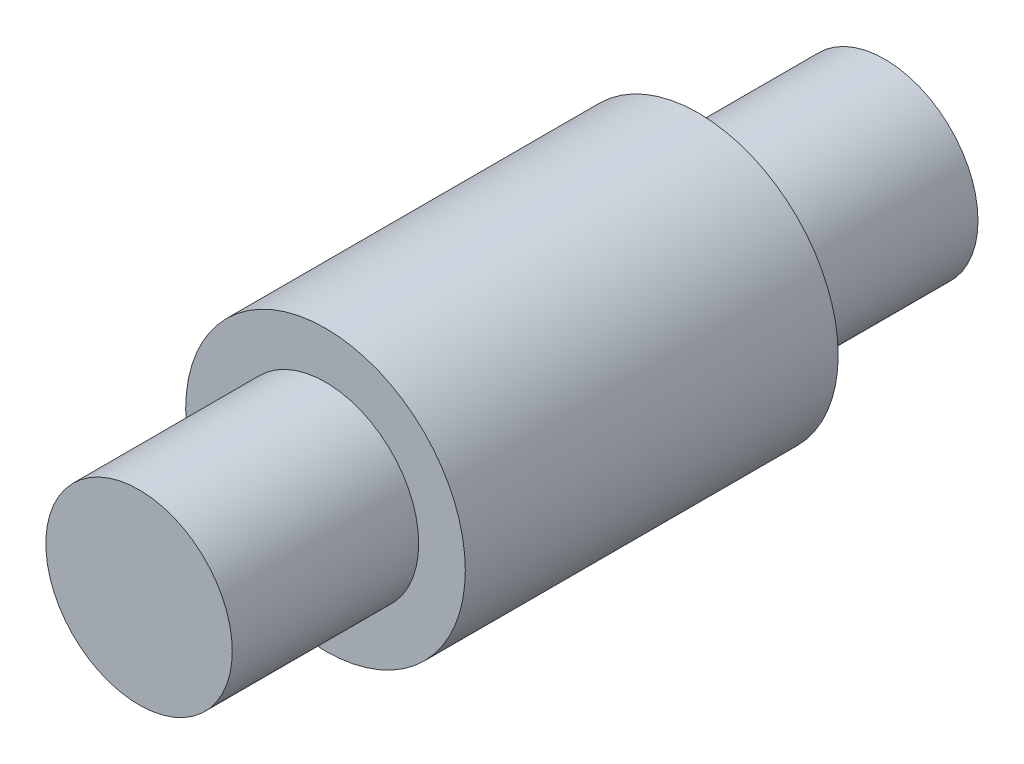
ISO-10303-21;
HEADER;
FILE_DESCRIPTION(('STEP AP214'),'2;1');
FILE_NAME('part.step','',(''),(''),'','','');
FILE_SCHEMA(('AUTOMOTIVE_DESIGN { 1 0 10303 214 1 1 1 1 }'));
ENDSEC;
DATA;
#1=APPLICATION_CONTEXT('core data for automotive mechanical design processes');
#2=APPLICATION_PROTOCOL_DEFINITION('international standard','automotive_design',2000,#1);
#3=PRODUCT_CONTEXT('',#1,'mechanical');
#4=PRODUCT('Part','Part','',(#3));
#5=PRODUCT_RELATED_PRODUCT_CATEGORY('part','',(#4));
#6=PRODUCT_DEFINITION_FORMATION('','',#4);
#7=PRODUCT_DEFINITION_CONTEXT('part definition',#1,'design');
#8=PRODUCT_DEFINITION('design','',#6,#7);
#9=PRODUCT_DEFINITION_SHAPE('','',#8);
#10=(LENGTH_UNIT() NAMED_UNIT(*) SI_UNIT(.MILLI.,.METRE.));
#11=(NAMED_UNIT(*) PLANE_ANGLE_UNIT() SI_UNIT($,.RADIAN.));
#12=(NAMED_UNIT(*) SI_UNIT($,.STERADIAN.) SOLID_ANGLE_UNIT());
#13=UNCERTAINTY_MEASURE_WITH_UNIT(LENGTH_MEASURE(1.E-05),#10,'distance_accuracy_value','');
#14=(GEOMETRIC_REPRESENTATION_CONTEXT(3) GLOBAL_UNCERTAINTY_ASSIGNED_CONTEXT((#13)) GLOBAL_UNIT_ASSIGNED_CONTEXT((#10,
#11,#12)) REPRESENTATION_CONTEXT('',''));
#15=CARTESIAN_POINT('',(0.,0.,0.));
#16=DIRECTION('',(0.,0.,1.));
#17=DIRECTION('',(1.,0.,0.));
#18=AXIS2_PLACEMENT_3D('',#15,#16,#17);
#19=CARTESIAN_POINT('',(0.,0.,0.));
#20=DIRECTION('',(0.,0.,-1.));
#21=DIRECTION('',(-1.,0.,0.));
#22=AXIS2_PLACEMENT_3D('',#19,#20,#21);
#23=PLANE('',#22);
#24=CARTESIAN_POINT('',(0.,0.,0.));
#25=DIRECTION('',(0.,0.,1.));
#26=DIRECTION('',(1.,0.,0.));
#27=AXIS2_PLACEMENT_3D('',#24,#25,#26);
#28=CIRCLE('',#27,3.175);
#29=CARTESIAN_POINT('',(3.175,0.,0.));
#30=VERTEX_POINT('',#29);
#31=EDGE_CURVE('E10',#30,#30,#28,.T.);
#32=ORIENTED_EDGE('',*,*,#31,.F.);
#33=EDGE_LOOP('',(#32));
#34=FACE_BOUND('',#33,.T.);
#35=ADVANCED_FACE('F31',(#34),#23,.T.);
#36=CARTESIAN_POINT('',(0.,0.,25.4));
#37=DIRECTION('',(0.,0.,1.));
#38=DIRECTION('',(1.,0.,0.));
#39=AXIS2_PLACEMENT_3D('',#36,#37,#38);
#40=CYLINDRICAL_SURFACE('',#39,3.175);
#41=ORIENTED_EDGE('',*,*,#31,.T.);
#42=EDGE_LOOP('',(#41));
#43=FACE_BOUND('',#42,.T.);
#44=CARTESIAN_POINT('',(0.,0.,6.35));
#45=DIRECTION('',(0.,0.,1.));
#46=DIRECTION('',(1.,0.,0.));
#47=AXIS2_PLACEMENT_3D('',#44,#45,#46);
#48=CIRCLE('',#47,3.175);
#49=CARTESIAN_POINT('',(3.175,0.,6.35));
#50=VERTEX_POINT('',#49);
#51=EDGE_CURVE('E37',#50,#50,#48,.T.);
#52=ORIENTED_EDGE('',*,*,#51,.F.);
#53=EDGE_LOOP('',(#52));
#54=FACE_BOUND('',#53,.T.);
#55=ADVANCED_FACE('F73',(#43,#54),#40,.T.);
#56=CARTESIAN_POINT('',(3.175,0.,6.35));
#57=DIRECTION('',(0.,0.,-1.));
#58=DIRECTION('',(-1.,0.,0.));
#59=AXIS2_PLACEMENT_3D('',#56,#57,#58);
#60=PLANE('',#59);
#61=ORIENTED_EDGE('',*,*,#51,.T.);
#62=EDGE_LOOP('',(#61));
#63=FACE_BOUND('',#62,.T.);
#64=CARTESIAN_POINT('',(0.,0.,6.35));
#65=DIRECTION('',(0.,0.,1.));
#66=DIRECTION('',(1.,0.,0.));
#67=AXIS2_PLACEMENT_3D('',#64,#65,#66);
#68=CIRCLE('',#67,4.7625);
#69=CARTESIAN_POINT('',(4.7625,0.,6.35));
#70=VERTEX_POINT('',#69);
#71=EDGE_CURVE('E41',#70,#70,#68,.T.);
#72=ORIENTED_EDGE('',*,*,#71,.F.);
#73=EDGE_LOOP('',(#72));
#74=FACE_BOUND('',#73,.T.);
#75=ADVANCED_FACE('F78',(#63,#74),#60,.T.);
#76=CARTESIAN_POINT('',(0.,0.,25.4));
#77=DIRECTION('',(0.,0.,1.));
#78=DIRECTION('',(1.,0.,0.));
#79=AXIS2_PLACEMENT_3D('',#76,#77,#78);
#80=CYLINDRICAL_SURFACE('',#79,4.7625);
#81=ORIENTED_EDGE('',*,*,#71,.T.);
#82=EDGE_LOOP('',(#81));
#83=FACE_BOUND('',#82,.T.);
#84=CARTESIAN_POINT('',(0.,0.,19.05));
#85=DIRECTION('',(0.,0.,1.));
#86=DIRECTION('',(1.,0.,0.));
#87=AXIS2_PLACEMENT_3D('',#84,#85,#86);
#88=CIRCLE('',#87,4.7625);
#89=CARTESIAN_POINT('',(4.7625,0.,19.05));
#90=VERTEX_POINT('',#89);
#91=EDGE_CURVE('E45',#90,#90,#88,.T.);
#92=ORIENTED_EDGE('',*,*,#91,.F.);
#93=EDGE_LOOP('',(#92));
#94=FACE_BOUND('',#93,.T.);
#95=ADVANCED_FACE('F69',(#83,#94),#80,.T.);
#96=CARTESIAN_POINT('',(4.7625,0.,19.05));
#97=DIRECTION('',(0.,0.,1.));
#98=DIRECTION('',(1.,0.,0.));
#99=AXIS2_PLACEMENT_3D('',#96,#97,#98);
#100=PLANE('',#99);
#101=ORIENTED_EDGE('',*,*,#91,.T.);
#102=EDGE_LOOP('',(#101));
#103=FACE_BOUND('',#102,.T.);
#104=CARTESIAN_POINT('',(0.,0.,19.05));
#105=DIRECTION('',(0.,0.,1.));
#106=DIRECTION('',(1.,0.,0.));
#107=AXIS2_PLACEMENT_3D('',#104,#105,#106);
#108=CIRCLE('',#107,3.175);
#109=CARTESIAN_POINT('',(3.175,0.,19.05));
#110=VERTEX_POINT('',#109);
#111=EDGE_CURVE('E50',#110,#110,#108,.T.);
#112=ORIENTED_EDGE('',*,*,#111,.F.);
#113=EDGE_LOOP('',(#112));
#114=FACE_BOUND('',#113,.T.);
#115=ADVANCED_FACE('F61',(#103,#114),#100,.T.);
#116=CARTESIAN_POINT('',(0.,0.,25.4));
#117=DIRECTION('',(0.,0.,1.));
#118=DIRECTION('',(1.,0.,0.));
#119=AXIS2_PLACEMENT_3D('',#116,#117,#118);
#120=CYLINDRICAL_SURFACE('',#119,3.175);
#121=ORIENTED_EDGE('',*,*,#111,.T.);
#122=EDGE_LOOP('',(#121));
#123=FACE_BOUND('',#122,.T.);
#124=CARTESIAN_POINT('',(0.,0.,25.4));
#125=DIRECTION('',(0.,0.,1.));
#126=DIRECTION('',(1.,0.,0.));
#127=AXIS2_PLACEMENT_3D('',#124,#125,#126);
#128=CIRCLE('',#127,3.175);
#129=CARTESIAN_POINT('',(3.175,0.,25.4));
#130=VERTEX_POINT('',#129);
#131=EDGE_CURVE('E53',#130,#130,#128,.T.);
#132=ORIENTED_EDGE('',*,*,#131,.F.);
#133=EDGE_LOOP('',(#132));
#134=FACE_BOUND('',#133,.T.);
#135=ADVANCED_FACE('F59',(#123,#134),#120,.T.);
#136=CARTESIAN_POINT('',(3.175,0.,25.4));
#137=DIRECTION('',(0.,0.,1.));
#138=DIRECTION('',(1.,0.,0.));
#139=AXIS2_PLACEMENT_3D('',#136,#137,#138);
#140=PLANE('',#139);
#141=ORIENTED_EDGE('',*,*,#131,.T.);
#142=EDGE_LOOP('',(#141));
#143=FACE_BOUND('',#142,.T.);
#144=ADVANCED_FACE('F57',(#143),#140,.T.);
#145=CLOSED_SHELL('',(#35,#55,#75,#95,#115,#135,#144));
#146=MANIFOLD_SOLID_BREP('B2',#145);
#147=ADVANCED_BREP_SHAPE_REPRESENTATION('',(#18,#146),#14);
#148=SHAPE_DEFINITION_REPRESENTATION(#9,#147);
ENDSEC;
END-ISO-10303-21;
